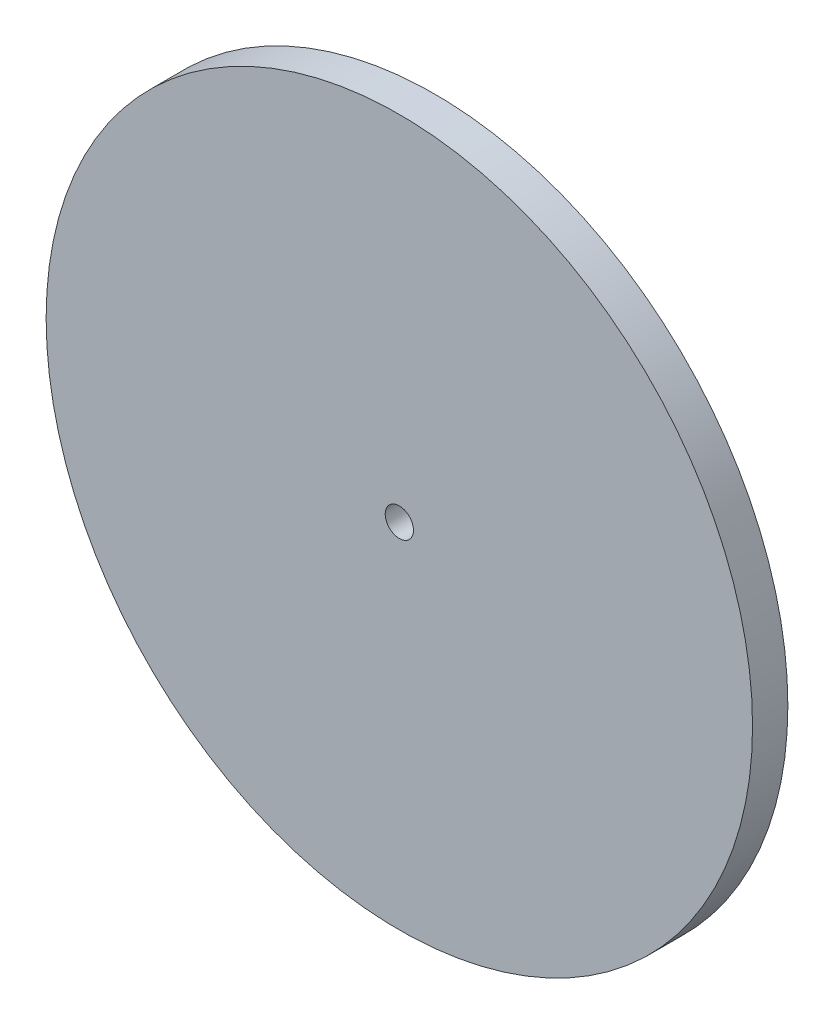
ISO-10303-21;
HEADER;
FILE_DESCRIPTION(('STEP AP214'),'2;1');
FILE_NAME('part.step','',(''),(''),'','','');
FILE_SCHEMA(('AUTOMOTIVE_DESIGN { 1 0 10303 214 1 1 1 1 }'));
ENDSEC;
DATA;
#1=APPLICATION_CONTEXT('core data for automotive mechanical design processes');
#2=APPLICATION_PROTOCOL_DEFINITION('international standard','automotive_design',2000,#1);
#3=PRODUCT_CONTEXT('',#1,'mechanical');
#4=PRODUCT('Part','Part','',(#3));
#5=PRODUCT_RELATED_PRODUCT_CATEGORY('part','',(#4));
#6=PRODUCT_DEFINITION_FORMATION('','',#4);
#7=PRODUCT_DEFINITION_CONTEXT('part definition',#1,'design');
#8=PRODUCT_DEFINITION('design','',#6,#7);
#9=PRODUCT_DEFINITION_SHAPE('','',#8);
#10=(LENGTH_UNIT() NAMED_UNIT(*) SI_UNIT(.MILLI.,.METRE.));
#11=(NAMED_UNIT(*) PLANE_ANGLE_UNIT() SI_UNIT($,.RADIAN.));
#12=(NAMED_UNIT(*) SI_UNIT($,.STERADIAN.) SOLID_ANGLE_UNIT());
#13=UNCERTAINTY_MEASURE_WITH_UNIT(LENGTH_MEASURE(1.E-05),#10,'distance_accuracy_value','');
#14=(GEOMETRIC_REPRESENTATION_CONTEXT(3) GLOBAL_UNCERTAINTY_ASSIGNED_CONTEXT((#13)) GLOBAL_UNIT_ASSIGNED_CONTEXT((#10,
#11,#12)) REPRESENTATION_CONTEXT('',''));
#15=CARTESIAN_POINT('',(0.,0.,0.));
#16=DIRECTION('',(0.,0.,1.));
#17=DIRECTION('',(1.,0.,0.));
#18=AXIS2_PLACEMENT_3D('',#15,#16,#17);
#19=CARTESIAN_POINT('',(0.,0.,10.));
#20=DIRECTION('',(0.,0.,1.));
#21=DIRECTION('',(1.,0.,0.));
#22=AXIS2_PLACEMENT_3D('',#19,#20,#21);
#23=PLANE('',#22);
#24=CARTESIAN_POINT('',(0.,0.,10.));
#25=DIRECTION('',(0.,0.,1.));
#26=DIRECTION('',(1.,0.,0.));
#27=AXIS2_PLACEMENT_3D('',#24,#25,#26);
#28=CIRCLE('',#27,100.);
#29=CARTESIAN_POINT('',(100.,0.,10.));
#30=VERTEX_POINT('',#29);
#31=EDGE_CURVE('E10',#30,#30,#28,.T.);
#32=ORIENTED_EDGE('',*,*,#31,.T.);
#33=EDGE_LOOP('',(#32));
#34=FACE_BOUND('',#33,.T.);
#35=CARTESIAN_POINT('',(0.,0.,10.));
#36=DIRECTION('',(0.,0.,1.));
#37=DIRECTION('',(1.,0.,0.));
#38=AXIS2_PLACEMENT_3D('',#35,#36,#37);
#39=CIRCLE('',#38,4.);
#40=CARTESIAN_POINT('',(4.,0.,10.));
#41=VERTEX_POINT('',#40);
#42=EDGE_CURVE('E50',#41,#41,#39,.T.);
#43=ORIENTED_EDGE('',*,*,#42,.F.);
#44=EDGE_LOOP('',(#43));
#45=FACE_BOUND('',#44,.T.);
#46=ADVANCED_FACE('F37',(#34,#45),#23,.T.);
#47=CARTESIAN_POINT('',(0.,0.,0.));
#48=DIRECTION('',(0.,0.,1.));
#49=DIRECTION('',(1.,0.,0.));
#50=AXIS2_PLACEMENT_3D('',#47,#48,#49);
#51=PLANE('',#50);
#52=CARTESIAN_POINT('',(0.,0.,0.));
#53=DIRECTION('',(0.,0.,1.));
#54=DIRECTION('',(1.,0.,0.));
#55=AXIS2_PLACEMENT_3D('',#52,#53,#54);
#56=CIRCLE('',#55,100.);
#57=CARTESIAN_POINT('',(100.,0.,0.));
#58=VERTEX_POINT('',#57);
#59=EDGE_CURVE('E41',#58,#58,#56,.T.);
#60=ORIENTED_EDGE('',*,*,#59,.F.);
#61=EDGE_LOOP('',(#60));
#62=FACE_BOUND('',#61,.T.);
#63=CARTESIAN_POINT('',(0.,0.,0.));
#64=DIRECTION('',(0.,0.,1.));
#65=DIRECTION('',(1.,0.,0.));
#66=AXIS2_PLACEMENT_3D('',#63,#64,#65);
#67=CIRCLE('',#66,4.);
#68=CARTESIAN_POINT('',(4.,0.,0.));
#69=VERTEX_POINT('',#68);
#70=EDGE_CURVE('E52',#69,#69,#67,.T.);
#71=ORIENTED_EDGE('',*,*,#70,.T.);
#72=EDGE_LOOP('',(#71));
#73=FACE_BOUND('',#72,.T.);
#74=ADVANCED_FACE('F64',(#62,#73),#51,.F.);
#75=CARTESIAN_POINT('',(0.,0.,10.));
#76=DIRECTION('',(0.,0.,-1.));
#77=DIRECTION('',(-1.,0.,0.));
#78=AXIS2_PLACEMENT_3D('',#75,#76,#77);
#79=CYLINDRICAL_SURFACE('',#78,100.);
#80=ORIENTED_EDGE('',*,*,#31,.F.);
#81=EDGE_LOOP('',(#80));
#82=FACE_BOUND('',#81,.T.);
#83=ORIENTED_EDGE('',*,*,#59,.T.);
#84=EDGE_LOOP('',(#83));
#85=FACE_BOUND('',#84,.T.);
#86=ADVANCED_FACE('F39',(#82,#85),#79,.T.);
#87=CARTESIAN_POINT('',(0.,0.,10.));
#88=DIRECTION('',(0.,0.,-1.));
#89=DIRECTION('',(-1.,0.,0.));
#90=AXIS2_PLACEMENT_3D('',#87,#88,#89);
#91=CYLINDRICAL_SURFACE('',#90,4.);
#92=ORIENTED_EDGE('',*,*,#42,.T.);
#93=EDGE_LOOP('',(#92));
#94=FACE_BOUND('',#93,.T.);
#95=ORIENTED_EDGE('',*,*,#70,.F.);
#96=EDGE_LOOP('',(#95));
#97=FACE_BOUND('',#96,.T.);
#98=ADVANCED_FACE('F60',(#94,#97),#91,.F.);
#99=CLOSED_SHELL('',(#46,#74,#86,#98));
#100=MANIFOLD_SOLID_BREP('B2',#99);
#101=ADVANCED_BREP_SHAPE_REPRESENTATION('',(#18,#100),#14);
#102=SHAPE_DEFINITION_REPRESENTATION(#9,#101);
ENDSEC;
END-ISO-10303-21;
